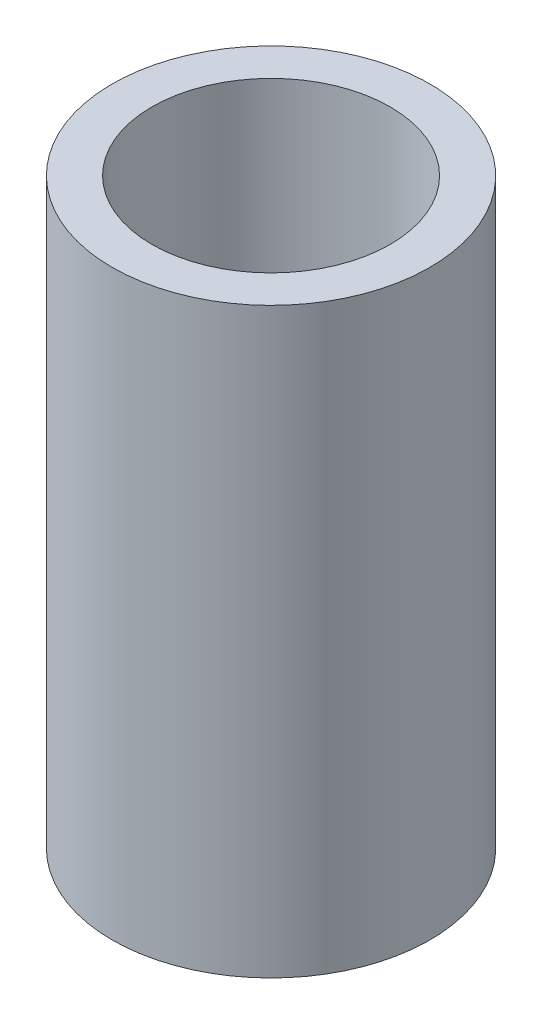
ISO-10303-21;
HEADER;
FILE_DESCRIPTION(('STEP AP214'),'2;1');
FILE_NAME('part.step','',(''),(''),'','','');
FILE_SCHEMA(('AUTOMOTIVE_DESIGN { 1 0 10303 214 1 1 1 1 }'));
ENDSEC;
DATA;
#1=APPLICATION_CONTEXT('core data for automotive mechanical design processes');
#2=APPLICATION_PROTOCOL_DEFINITION('international standard','automotive_design',2000,#1);
#3=PRODUCT_CONTEXT('',#1,'mechanical');
#4=PRODUCT('Part','Part','',(#3));
#5=PRODUCT_RELATED_PRODUCT_CATEGORY('part','',(#4));
#6=PRODUCT_DEFINITION_FORMATION('','',#4);
#7=PRODUCT_DEFINITION_CONTEXT('part definition',#1,'design');
#8=PRODUCT_DEFINITION('design','',#6,#7);
#9=PRODUCT_DEFINITION_SHAPE('','',#8);
#10=(LENGTH_UNIT() NAMED_UNIT(*) SI_UNIT(.MILLI.,.METRE.));
#11=(NAMED_UNIT(*) PLANE_ANGLE_UNIT() SI_UNIT($,.RADIAN.));
#12=(NAMED_UNIT(*) SI_UNIT($,.STERADIAN.) SOLID_ANGLE_UNIT());
#13=UNCERTAINTY_MEASURE_WITH_UNIT(LENGTH_MEASURE(1.E-05),#10,'distance_accuracy_value','');
#14=(GEOMETRIC_REPRESENTATION_CONTEXT(3) GLOBAL_UNCERTAINTY_ASSIGNED_CONTEXT((#13)) GLOBAL_UNIT_ASSIGNED_CONTEXT((#10,
#11,#12)) REPRESENTATION_CONTEXT('',''));
#15=CARTESIAN_POINT('',(0.,0.,0.));
#16=DIRECTION('',(0.,0.,1.));
#17=DIRECTION('',(1.,0.,0.));
#18=AXIS2_PLACEMENT_3D('',#15,#16,#17);
#19=CARTESIAN_POINT('',(0.,11.,0.));
#20=DIRECTION('',(0.,1.,0.));
#21=DIRECTION('',(0.,0.,1.));
#22=AXIS2_PLACEMENT_3D('',#19,#20,#21);
#23=PLANE('',#22);
#24=CARTESIAN_POINT('',(0.,11.,0.));
#25=DIRECTION('',(0.,1.,0.));
#26=DIRECTION('',(0.,0.,1.));
#27=AXIS2_PLACEMENT_3D('',#24,#25,#26);
#28=CIRCLE('',#27,3.);
#29=CARTESIAN_POINT('',(0.,11.,3.));
#30=VERTEX_POINT('',#29);
#31=EDGE_CURVE('E10',#30,#30,#28,.T.);
#32=ORIENTED_EDGE('',*,*,#31,.T.);
#33=EDGE_LOOP('',(#32));
#34=FACE_BOUND('',#33,.T.);
#35=CARTESIAN_POINT('',(0.,11.,0.));
#36=DIRECTION('',(0.,1.,0.));
#37=DIRECTION('',(0.,0.,1.));
#38=AXIS2_PLACEMENT_3D('',#35,#36,#37);
#39=CIRCLE('',#38,2.25);
#40=CARTESIAN_POINT('',(0.,11.,2.25));
#41=VERTEX_POINT('',#40);
#42=EDGE_CURVE('E56',#41,#41,#39,.T.);
#43=ORIENTED_EDGE('',*,*,#42,.F.);
#44=EDGE_LOOP('',(#43));
#45=FACE_BOUND('',#44,.T.);
#46=ADVANCED_FACE('F43',(#34,#45),#23,.T.);
#47=CARTESIAN_POINT('',(0.,0.,0.));
#48=DIRECTION('',(0.,1.,0.));
#49=DIRECTION('',(0.,0.,1.));
#50=AXIS2_PLACEMENT_3D('',#47,#48,#49);
#51=PLANE('',#50);
#52=CARTESIAN_POINT('',(0.,0.,0.));
#53=DIRECTION('',(0.,1.,0.));
#54=DIRECTION('',(0.,0.,1.));
#55=AXIS2_PLACEMENT_3D('',#52,#53,#54);
#56=CIRCLE('',#55,3.);
#57=CARTESIAN_POINT('',(0.,0.,3.));
#58=VERTEX_POINT('',#57);
#59=EDGE_CURVE('E47',#58,#58,#56,.T.);
#60=ORIENTED_EDGE('',*,*,#59,.F.);
#61=EDGE_LOOP('',(#60));
#62=FACE_BOUND('',#61,.T.);
#63=CARTESIAN_POINT('',(0.,0.,0.));
#64=DIRECTION('',(0.,1.,0.));
#65=DIRECTION('',(0.,0.,1.));
#66=AXIS2_PLACEMENT_3D('',#63,#64,#65);
#67=CIRCLE('',#66,2.25);
#68=CARTESIAN_POINT('',(0.,0.,2.25));
#69=VERTEX_POINT('',#68);
#70=EDGE_CURVE('E58',#69,#69,#67,.T.);
#71=ORIENTED_EDGE('',*,*,#70,.T.);
#72=EDGE_LOOP('',(#71));
#73=FACE_BOUND('',#72,.T.);
#74=ADVANCED_FACE('F70',(#62,#73),#51,.F.);
#75=CARTESIAN_POINT('',(0.,11.,0.));
#76=DIRECTION('',(0.,-1.,0.));
#77=DIRECTION('',(0.,0.,-1.));
#78=AXIS2_PLACEMENT_3D('',#75,#76,#77);
#79=CYLINDRICAL_SURFACE('',#78,3.);
#80=ORIENTED_EDGE('',*,*,#31,.F.);
#81=EDGE_LOOP('',(#80));
#82=FACE_BOUND('',#81,.T.);
#83=ORIENTED_EDGE('',*,*,#59,.T.);
#84=EDGE_LOOP('',(#83));
#85=FACE_BOUND('',#84,.T.);
#86=ADVANCED_FACE('F45',(#82,#85),#79,.T.);
#87=CARTESIAN_POINT('',(0.,11.,0.));
#88=DIRECTION('',(0.,-1.,0.));
#89=DIRECTION('',(0.,0.,-1.));
#90=AXIS2_PLACEMENT_3D('',#87,#88,#89);
#91=CYLINDRICAL_SURFACE('',#90,2.25);
#92=ORIENTED_EDGE('',*,*,#42,.T.);
#93=EDGE_LOOP('',(#92));
#94=FACE_BOUND('',#93,.T.);
#95=ORIENTED_EDGE('',*,*,#70,.F.);
#96=EDGE_LOOP('',(#95));
#97=FACE_BOUND('',#96,.T.);
#98=ADVANCED_FACE('F66',(#94,#97),#91,.F.);
#99=CLOSED_SHELL('',(#46,#74,#86,#98));
#100=MANIFOLD_SOLID_BREP('B2',#99);
#101=ADVANCED_BREP_SHAPE_REPRESENTATION('',(#18,#100),#14);
#102=SHAPE_DEFINITION_REPRESENTATION(#9,#101);
ENDSEC;
END-ISO-10303-21;
